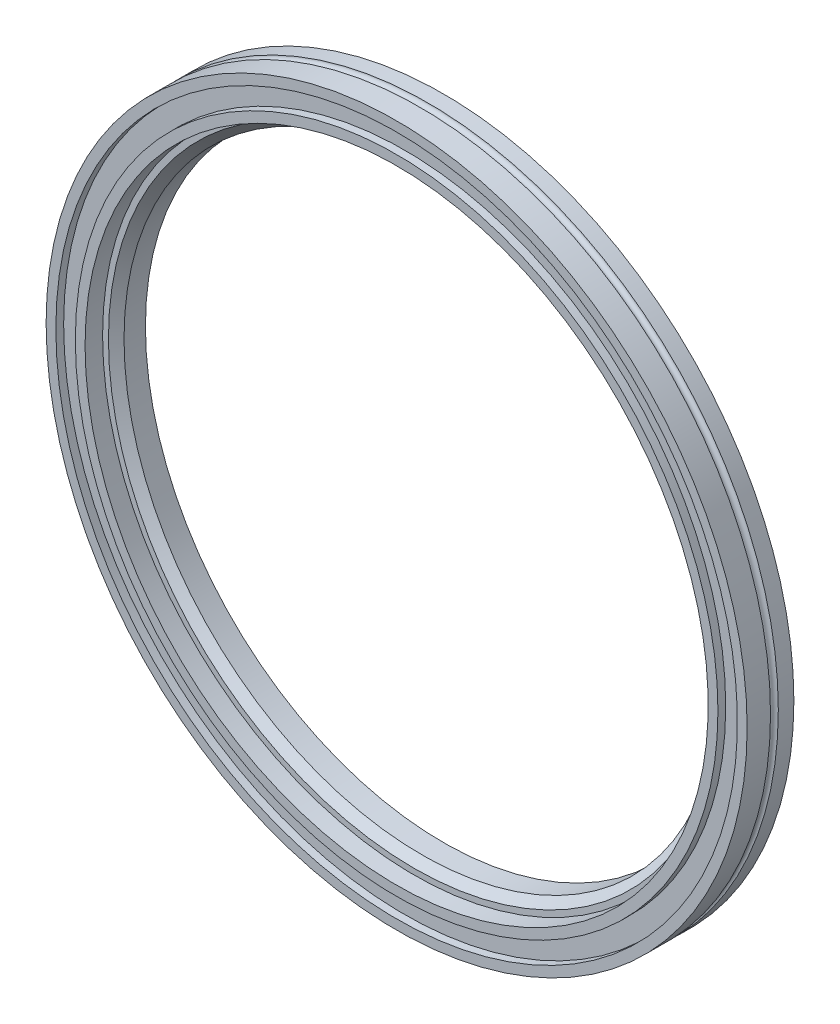
ISO-10303-21;
HEADER;
FILE_DESCRIPTION(('STEP AP214'),'2;1');
FILE_NAME('part.step','',(''),(''),'','','');
FILE_SCHEMA(('AUTOMOTIVE_DESIGN { 1 0 10303 214 1 1 1 1 }'));
ENDSEC;
DATA;
#1=APPLICATION_CONTEXT('core data for automotive mechanical design processes');
#2=APPLICATION_PROTOCOL_DEFINITION('international standard','automotive_design',2000,#1);
#3=PRODUCT_CONTEXT('',#1,'mechanical');
#4=PRODUCT('Part','Part','',(#3));
#5=PRODUCT_RELATED_PRODUCT_CATEGORY('part','',(#4));
#6=PRODUCT_DEFINITION_FORMATION('','',#4);
#7=PRODUCT_DEFINITION_CONTEXT('part definition',#1,'design');
#8=PRODUCT_DEFINITION('design','',#6,#7);
#9=PRODUCT_DEFINITION_SHAPE('','',#8);
#10=(LENGTH_UNIT() NAMED_UNIT(*) SI_UNIT(.MILLI.,.METRE.));
#11=(NAMED_UNIT(*) PLANE_ANGLE_UNIT() SI_UNIT($,.RADIAN.));
#12=(NAMED_UNIT(*) SI_UNIT($,.STERADIAN.) SOLID_ANGLE_UNIT());
#13=UNCERTAINTY_MEASURE_WITH_UNIT(LENGTH_MEASURE(1.E-05),#10,'distance_accuracy_value','');
#14=(GEOMETRIC_REPRESENTATION_CONTEXT(3) GLOBAL_UNCERTAINTY_ASSIGNED_CONTEXT((#13)) GLOBAL_UNIT_ASSIGNED_CONTEXT((#10,
#11,#12)) REPRESENTATION_CONTEXT('',''));
#15=CARTESIAN_POINT('',(0.,0.,0.));
#16=DIRECTION('',(0.,0.,1.));
#17=DIRECTION('',(1.,0.,0.));
#18=AXIS2_PLACEMENT_3D('',#15,#16,#17);
#19=CARTESIAN_POINT('',(0.,0.,54.));
#20=DIRECTION('',(0.,0.,1.));
#21=DIRECTION('',(-1.,0.,0.));
#22=AXIS2_PLACEMENT_3D('',#19,#20,#21);
#23=CYLINDRICAL_SURFACE('',#22,76.5);
#24=CARTESIAN_POINT('',(0.,0.,5.5));
#25=DIRECTION('',(0.,0.,1.));
#26=DIRECTION('',(-1.,0.,0.));
#27=AXIS2_PLACEMENT_3D('',#24,#25,#26);
#28=CIRCLE('',#27,76.5);
#29=CARTESIAN_POINT('',(-76.5,0.,5.5));
#30=VERTEX_POINT('',#29);
#31=EDGE_CURVE('E124',#30,#30,#28,.T.);
#32=ORIENTED_EDGE('',*,*,#31,.T.);
#33=EDGE_LOOP('',(#32));
#34=FACE_BOUND('',#33,.T.);
#35=CARTESIAN_POINT('',(0.,0.,0.));
#36=DIRECTION('',(0.,0.,-1.));
#37=DIRECTION('',(-1.,0.,0.));
#38=AXIS2_PLACEMENT_3D('',#35,#36,#37);
#39=CIRCLE('',#38,76.5);
#40=CARTESIAN_POINT('',(-76.5,0.,0.));
#41=VERTEX_POINT('',#40);
#42=EDGE_CURVE('E109',#41,#41,#39,.T.);
#43=ORIENTED_EDGE('',*,*,#42,.T.);
#44=EDGE_LOOP('',(#43));
#45=FACE_BOUND('',#44,.T.);
#46=ADVANCED_FACE('F16',(#34,#45),#23,.F.);
#47=CARTESIAN_POINT('',(-80.,0.,7.5));
#48=DIRECTION('',(0.,0.,-1.));
#49=DIRECTION('',(0.,-1.,0.));
#50=AXIS2_PLACEMENT_3D('',#47,#48,#49);
#51=PLANE('',#50);
#52=CARTESIAN_POINT('',(0.,0.,7.5));
#53=DIRECTION('',(0.,0.,-1.));
#54=DIRECTION('',(-1.,0.,0.));
#55=AXIS2_PLACEMENT_3D('',#52,#53,#54);
#56=CIRCLE('',#55,78.5);
#57=CARTESIAN_POINT('',(-78.5,0.,7.5));
#58=VERTEX_POINT('',#57);
#59=EDGE_CURVE('E117',#58,#58,#56,.T.);
#60=ORIENTED_EDGE('',*,*,#59,.T.);
#61=EDGE_LOOP('',(#60));
#62=FACE_BOUND('',#61,.T.);
#63=CARTESIAN_POINT('',(0.,0.,7.5));
#64=DIRECTION('',(0.,0.,-1.));
#65=DIRECTION('',(-1.,0.,0.));
#66=AXIS2_PLACEMENT_3D('',#63,#64,#65);
#67=CIRCLE('',#66,80.);
#68=CARTESIAN_POINT('',(-80.,0.,7.5));
#69=VERTEX_POINT('',#68);
#70=EDGE_CURVE('E11',#69,#69,#67,.T.);
#71=ORIENTED_EDGE('',*,*,#70,.F.);
#72=EDGE_LOOP('',(#71));
#73=FACE_BOUND('',#72,.T.);
#74=ADVANCED_FACE('F182',(#62,#73),#51,.F.);
#75=CARTESIAN_POINT('',(0.,0.,54.));
#76=DIRECTION('',(0.,0.,1.));
#77=DIRECTION('',(-1.,0.,0.));
#78=AXIS2_PLACEMENT_3D('',#75,#76,#77);
#79=CYLINDRICAL_SURFACE('',#78,80.);
#80=CARTESIAN_POINT('',(0.,0.,12.));
#81=DIRECTION('',(0.,0.,-1.));
#82=DIRECTION('',(-1.,0.,0.));
#83=AXIS2_PLACEMENT_3D('',#80,#81,#82);
#84=CIRCLE('',#83,80.);
#85=CARTESIAN_POINT('',(-80.,0.,12.));
#86=VERTEX_POINT('',#85);
#87=EDGE_CURVE('E27',#86,#86,#84,.T.);
#88=ORIENTED_EDGE('',*,*,#87,.F.);
#89=EDGE_LOOP('',(#88));
#90=FACE_BOUND('',#89,.T.);
#91=ORIENTED_EDGE('',*,*,#70,.T.);
#92=EDGE_LOOP('',(#91));
#93=FACE_BOUND('',#92,.T.);
#94=ADVANCED_FACE('F154',(#90,#93),#79,.F.);
#95=CARTESIAN_POINT('',(-82.5,0.,12.));
#96=DIRECTION('',(0.,0.,-1.));
#97=DIRECTION('',(0.,-1.,0.));
#98=AXIS2_PLACEMENT_3D('',#95,#96,#97);
#99=PLANE('',#98);
#100=ORIENTED_EDGE('',*,*,#87,.T.);
#101=EDGE_LOOP('',(#100));
#102=FACE_BOUND('',#101,.T.);
#103=CARTESIAN_POINT('',(0.,0.,12.));
#104=DIRECTION('',(0.,0.,-1.));
#105=DIRECTION('',(-1.,0.,0.));
#106=AXIS2_PLACEMENT_3D('',#103,#104,#105);
#107=CIRCLE('',#106,82.5);
#108=CARTESIAN_POINT('',(-82.5,0.,12.));
#109=VERTEX_POINT('',#108);
#110=EDGE_CURVE('E98',#109,#109,#107,.T.);
#111=ORIENTED_EDGE('',*,*,#110,.F.);
#112=EDGE_LOOP('',(#111));
#113=FACE_BOUND('',#112,.T.);
#114=ADVANCED_FACE('F148',(#102,#113),#99,.F.);
#115=CARTESIAN_POINT('',(0.,0.,54.));
#116=DIRECTION('',(0.,0.,1.));
#117=DIRECTION('',(-1.,0.,0.));
#118=AXIS2_PLACEMENT_3D('',#115,#116,#117);
#119=CYLINDRICAL_SURFACE('',#118,82.5);
#120=CARTESIAN_POINT('',(0.,0.,10.));
#121=DIRECTION('',(0.,0.,-1.));
#122=DIRECTION('',(-1.,0.,0.));
#123=AXIS2_PLACEMENT_3D('',#120,#121,#122);
#124=CIRCLE('',#123,82.5);
#125=CARTESIAN_POINT('',(-82.5,0.,10.));
#126=VERTEX_POINT('',#125);
#127=EDGE_CURVE('E94',#126,#126,#124,.T.);
#128=ORIENTED_EDGE('',*,*,#127,.F.);
#129=EDGE_LOOP('',(#128));
#130=FACE_BOUND('',#129,.T.);
#131=ORIENTED_EDGE('',*,*,#110,.T.);
#132=EDGE_LOOP('',(#131));
#133=FACE_BOUND('',#132,.T.);
#134=ADVANCED_FACE('F153',(#130,#133),#119,.T.);
#135=CARTESIAN_POINT('',(-87.5,0.,10.));
#136=DIRECTION('',(0.,0.,-1.));
#137=DIRECTION('',(0.,-1.,0.));
#138=AXIS2_PLACEMENT_3D('',#135,#136,#137);
#139=PLANE('',#138);
#140=ORIENTED_EDGE('',*,*,#127,.T.);
#141=EDGE_LOOP('',(#140));
#142=FACE_BOUND('',#141,.T.);
#143=CARTESIAN_POINT('',(0.,0.,10.));
#144=DIRECTION('',(0.,0.,-1.));
#145=DIRECTION('',(-1.,0.,0.));
#146=AXIS2_PLACEMENT_3D('',#143,#144,#145);
#147=CIRCLE('',#146,87.5);
#148=CARTESIAN_POINT('',(-87.5,0.,10.));
#149=VERTEX_POINT('',#148);
#150=EDGE_CURVE('E99',#149,#149,#147,.T.);
#151=ORIENTED_EDGE('',*,*,#150,.F.);
#152=EDGE_LOOP('',(#151));
#153=FACE_BOUND('',#152,.T.);
#154=ADVANCED_FACE('F18',(#142,#153),#139,.F.);
#155=CARTESIAN_POINT('',(0.,0.,54.));
#156=DIRECTION('',(0.,0.,1.));
#157=DIRECTION('',(-1.,0.,0.));
#158=AXIS2_PLACEMENT_3D('',#155,#156,#157);
#159=CYLINDRICAL_SURFACE('',#158,87.5);
#160=CARTESIAN_POINT('',(0.,0.,12.));
#161=DIRECTION('',(0.,0.,-1.));
#162=DIRECTION('',(-1.,0.,0.));
#163=AXIS2_PLACEMENT_3D('',#160,#161,#162);
#164=CIRCLE('',#163,87.5);
#165=CARTESIAN_POINT('',(-87.5,0.,12.));
#166=VERTEX_POINT('',#165);
#167=EDGE_CURVE('E106',#166,#166,#164,.T.);
#168=ORIENTED_EDGE('',*,*,#167,.F.);
#169=EDGE_LOOP('',(#168));
#170=FACE_BOUND('',#169,.T.);
#171=ORIENTED_EDGE('',*,*,#150,.T.);
#172=EDGE_LOOP('',(#171));
#173=FACE_BOUND('',#172,.T.);
#174=ADVANCED_FACE('F170',(#170,#173),#159,.F.);
#175=CARTESIAN_POINT('',(-90.,0.,12.));
#176=DIRECTION('',(0.,0.,-1.));
#177=DIRECTION('',(0.,-1.,0.));
#178=AXIS2_PLACEMENT_3D('',#175,#176,#177);
#179=PLANE('',#178);
#180=ORIENTED_EDGE('',*,*,#167,.T.);
#181=EDGE_LOOP('',(#180));
#182=FACE_BOUND('',#181,.T.);
#183=CARTESIAN_POINT('',(0.,0.,12.));
#184=DIRECTION('',(0.,0.,-1.));
#185=DIRECTION('',(-1.,0.,0.));
#186=AXIS2_PLACEMENT_3D('',#183,#184,#185);
#187=CIRCLE('',#186,90.);
#188=CARTESIAN_POINT('',(-90.,0.,12.));
#189=VERTEX_POINT('',#188);
#190=EDGE_CURVE('E82',#189,#189,#187,.T.);
#191=ORIENTED_EDGE('',*,*,#190,.F.);
#192=EDGE_LOOP('',(#191));
#193=FACE_BOUND('',#192,.T.);
#194=ADVANCED_FACE('F165',(#182,#193),#179,.F.);
#195=CARTESIAN_POINT('',(0.,0.,54.));
#196=DIRECTION('',(0.,0.,1.));
#197=DIRECTION('',(-1.,0.,0.));
#198=AXIS2_PLACEMENT_3D('',#195,#196,#197);
#199=CYLINDRICAL_SURFACE('',#198,90.);
#200=CARTESIAN_POINT('',(0.,0.,5.99964767160081));
#201=DIRECTION('',(0.,0.,-1.));
#202=DIRECTION('',(-1.,0.,0.));
#203=AXIS2_PLACEMENT_3D('',#200,#201,#202);
#204=CIRCLE('',#203,90.);
#205=CARTESIAN_POINT('',(-90.,0.,5.99964767160081));
#206=VERTEX_POINT('',#205);
#207=EDGE_CURVE('E72',#206,#206,#204,.T.);
#208=ORIENTED_EDGE('',*,*,#207,.F.);
#209=EDGE_LOOP('',(#208));
#210=FACE_BOUND('',#209,.T.);
#211=ORIENTED_EDGE('',*,*,#190,.T.);
#212=EDGE_LOOP('',(#211));
#213=FACE_BOUND('',#212,.T.);
#214=ADVANCED_FACE('F169',(#210,#213),#199,.T.);
#215=CARTESIAN_POINT('',(0.,0.,5.));
#216=DIRECTION('',(0.,0.,-1.));
#217=DIRECTION('',(-1.,0.,0.));
#218=AXIS2_PLACEMENT_3D('',#215,#216,#217);
#219=TOROIDAL_SURFACE('',#218,90.0265430341723,1.);
#220=CARTESIAN_POINT('',(0.,0.,4.00035232839919));
#221=DIRECTION('',(0.,0.,-1.));
#222=DIRECTION('',(-1.,0.,0.));
#223=AXIS2_PLACEMENT_3D('',#220,#221,#222);
#224=CIRCLE('',#223,90.);
#225=CARTESIAN_POINT('',(-90.,0.,4.00035232839919));
#226=VERTEX_POINT('',#225);
#227=EDGE_CURVE('E20',#226,#226,#224,.T.);
#228=ORIENTED_EDGE('',*,*,#227,.F.);
#229=EDGE_LOOP('',(#228));
#230=FACE_BOUND('',#229,.T.);
#231=ORIENTED_EDGE('',*,*,#207,.T.);
#232=EDGE_LOOP('',(#231));
#233=FACE_BOUND('',#232,.T.);
#234=ADVANCED_FACE('F204',(#230,#233),#219,.F.);
#235=CARTESIAN_POINT('',(0.,0.,54.));
#236=DIRECTION('',(0.,0.,1.));
#237=DIRECTION('',(-1.,0.,0.));
#238=AXIS2_PLACEMENT_3D('',#235,#236,#237);
#239=CYLINDRICAL_SURFACE('',#238,90.);
#240=CARTESIAN_POINT('',(0.,0.,0.));
#241=DIRECTION('',(0.,0.,-1.));
#242=DIRECTION('',(-1.,0.,0.));
#243=AXIS2_PLACEMENT_3D('',#240,#241,#242);
#244=CIRCLE('',#243,90.);
#245=CARTESIAN_POINT('',(-90.,0.,0.));
#246=VERTEX_POINT('',#245);
#247=EDGE_CURVE('E111',#246,#246,#244,.T.);
#248=ORIENTED_EDGE('',*,*,#247,.F.);
#249=EDGE_LOOP('',(#248));
#250=FACE_BOUND('',#249,.T.);
#251=ORIENTED_EDGE('',*,*,#227,.T.);
#252=EDGE_LOOP('',(#251));
#253=FACE_BOUND('',#252,.T.);
#254=ADVANCED_FACE('F199',(#250,#253),#239,.T.);
#255=CARTESIAN_POINT('',(0.,0.,7.5));
#256=DIRECTION('',(0.,0.,1.));
#257=DIRECTION('',(1.,0.,0.));
#258=AXIS2_PLACEMENT_3D('',#255,#256,#257);
#259=CONICAL_SURFACE('',#258,78.5,0.785398163397448);
#260=ORIENTED_EDGE('',*,*,#31,.F.);
#261=EDGE_LOOP('',(#260));
#262=FACE_BOUND('',#261,.T.);
#263=ORIENTED_EDGE('',*,*,#59,.F.);
#264=EDGE_LOOP('',(#263));
#265=FACE_BOUND('',#264,.T.);
#266=ADVANCED_FACE('F203',(#262,#265),#259,.F.);
#267=CARTESIAN_POINT('',(-76.5,0.,0.));
#268=DIRECTION('',(0.,0.,1.));
#269=DIRECTION('',(1.,0.,0.));
#270=AXIS2_PLACEMENT_3D('',#267,#268,#269);
#271=PLANE('',#270);
#272=ORIENTED_EDGE('',*,*,#42,.F.);
#273=EDGE_LOOP('',(#272));
#274=FACE_BOUND('',#273,.T.);
#275=ORIENTED_EDGE('',*,*,#247,.T.);
#276=EDGE_LOOP('',(#275));
#277=FACE_BOUND('',#276,.T.);
#278=ADVANCED_FACE('F228',(#274,#277),#271,.F.);
#279=CLOSED_SHELL('',(#46,#74,#94,#114,#134,#154,#174,#194,#214,#234,#254,#266,#278));
#280=MANIFOLD_SOLID_BREP('B1',#279);
#281=ADVANCED_BREP_SHAPE_REPRESENTATION('',(#18,#280),#14);
#282=SHAPE_DEFINITION_REPRESENTATION(#9,#281);
ENDSEC;
END-ISO-10303-21;
